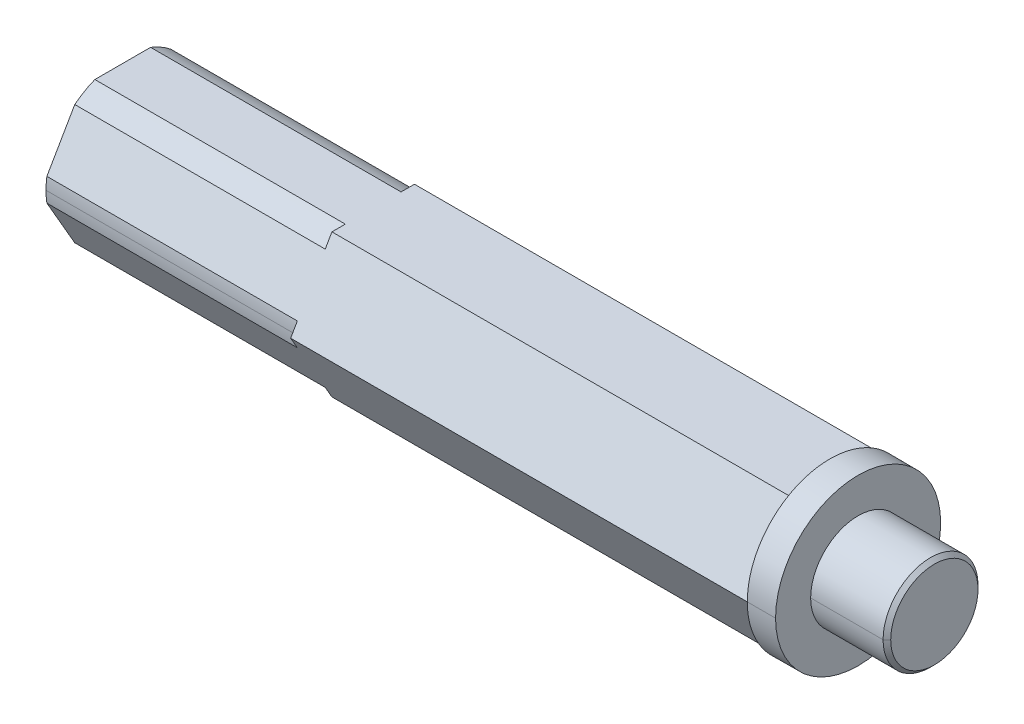
ISO-10303-21;
HEADER;
FILE_DESCRIPTION(('STEP AP214'),'2;1');
FILE_NAME('part.step','',(''),(''),'','','');
FILE_SCHEMA(('AUTOMOTIVE_DESIGN { 1 0 10303 214 1 1 1 1 }'));
ENDSEC;
DATA;
#1=APPLICATION_CONTEXT('core data for automotive mechanical design processes');
#2=APPLICATION_PROTOCOL_DEFINITION('international standard','automotive_design',2000,#1);
#3=PRODUCT_CONTEXT('',#1,'mechanical');
#4=PRODUCT('Part','Part','',(#3));
#5=PRODUCT_RELATED_PRODUCT_CATEGORY('part','',(#4));
#6=PRODUCT_DEFINITION_FORMATION('','',#4);
#7=PRODUCT_DEFINITION_CONTEXT('part definition',#1,'design');
#8=PRODUCT_DEFINITION('design','',#6,#7);
#9=PRODUCT_DEFINITION_SHAPE('','',#8);
#10=(LENGTH_UNIT() NAMED_UNIT(*) SI_UNIT(.MILLI.,.METRE.));
#11=(NAMED_UNIT(*) PLANE_ANGLE_UNIT() SI_UNIT($,.RADIAN.));
#12=(NAMED_UNIT(*) SI_UNIT($,.STERADIAN.) SOLID_ANGLE_UNIT());
#13=UNCERTAINTY_MEASURE_WITH_UNIT(LENGTH_MEASURE(1.E-05),#10,'distance_accuracy_value','');
#14=(GEOMETRIC_REPRESENTATION_CONTEXT(3) GLOBAL_UNCERTAINTY_ASSIGNED_CONTEXT((#13)) GLOBAL_UNIT_ASSIGNED_CONTEXT((#10,
#11,#12)) REPRESENTATION_CONTEXT('',''));
#15=CARTESIAN_POINT('',(0.,0.,0.));
#16=DIRECTION('',(0.,0.,1.));
#17=DIRECTION('',(1.,0.,0.));
#18=AXIS2_PLACEMENT_3D('',#15,#16,#17);
#19=CARTESIAN_POINT('',(30.5181,0.,0.));
#20=DIRECTION('',(-1.,0.,0.));
#21=DIRECTION('',(0.,0.,1.));
#22=AXIS2_PLACEMENT_3D('',#19,#20,#21);
#23=CONICAL_SURFACE('',#22,2.9083,0.785398163397448);
#24=DIRECTION('',(-0.707106781186548,0.,-0.707106781186547));
#25=VECTOR('',#24,1.);
#26=CARTESIAN_POINT('',(30.5181,0.,-2.9083));
#27=LINE('',#26,#25);
#28=CARTESIAN_POINT('',(30.5181,0.,-2.9083));
#29=VERTEX_POINT('',#28);
#30=CARTESIAN_POINT('',(30.2641,0.,-3.1623));
#31=VERTEX_POINT('',#30);
#32=EDGE_CURVE('E353',#29,#31,#27,.T.);
#33=ORIENTED_EDGE('',*,*,#32,.F.);
#34=CARTESIAN_POINT('',(30.5181,0.,0.));
#35=DIRECTION('',(1.,0.,0.));
#36=DIRECTION('',(0.,0.,-1.));
#37=AXIS2_PLACEMENT_3D('',#34,#35,#36);
#38=CIRCLE('',#37,2.9083);
#39=CARTESIAN_POINT('',(30.5181,0.,2.9083));
#40=VERTEX_POINT('',#39);
#41=EDGE_CURVE('E11',#40,#29,#38,.T.);
#42=ORIENTED_EDGE('',*,*,#41,.F.);
#43=DIRECTION('',(-0.707106781186548,0.,0.707106781186547));
#44=VECTOR('',#43,1.);
#45=CARTESIAN_POINT('',(30.5181,0.,2.9083));
#46=LINE('',#45,#44);
#47=CARTESIAN_POINT('',(30.2641,0.,3.1623));
#48=VERTEX_POINT('',#47);
#49=EDGE_CURVE('E299',#40,#48,#46,.T.);
#50=ORIENTED_EDGE('',*,*,#49,.T.);
#51=CARTESIAN_POINT('',(30.2641,0.,0.));
#52=DIRECTION('',(-1.,0.,0.));
#53=DIRECTION('',(0.,0.,-1.));
#54=AXIS2_PLACEMENT_3D('',#51,#52,#53);
#55=CIRCLE('',#54,3.1623);
#56=EDGE_CURVE('E27',#31,#48,#55,.T.);
#57=ORIENTED_EDGE('',*,*,#56,.F.);
#58=EDGE_LOOP('',(#33,#42,#50,#57));
#59=FACE_BOUND('',#58,.T.);
#60=ADVANCED_FACE('F16',(#59),#23,.T.);
#61=CARTESIAN_POINT('',(30.5181,0.,0.));
#62=DIRECTION('',(1.,0.,0.));
#63=DIRECTION('',(0.,1.,0.));
#64=AXIS2_PLACEMENT_3D('',#61,#62,#63);
#65=PLANE('',#64);
#66=ORIENTED_EDGE('',*,*,#41,.T.);
#67=CARTESIAN_POINT('',(30.5181,0.,0.));
#68=DIRECTION('',(1.,0.,0.));
#69=DIRECTION('',(0.,0.,-1.));
#70=AXIS2_PLACEMENT_3D('',#67,#68,#69);
#71=CIRCLE('',#70,2.9083);
#72=EDGE_CURVE('E207',#29,#40,#71,.T.);
#73=ORIENTED_EDGE('',*,*,#72,.T.);
#74=EDGE_LOOP('',(#66,#73));
#75=FACE_BOUND('',#74,.T.);
#76=ADVANCED_FACE('F623',(#75),#65,.T.);
#77=CARTESIAN_POINT('',(30.5181,0.,0.));
#78=DIRECTION('',(-1.,0.,0.));
#79=DIRECTION('',(0.,0.,1.));
#80=AXIS2_PLACEMENT_3D('',#77,#78,#79);
#81=CYLINDRICAL_SURFACE('',#80,3.1623);
#82=DIRECTION('',(-1.,0.,0.));
#83=VECTOR('',#82,1.);
#84=CARTESIAN_POINT('',(30.5181,0.,-3.1623));
#85=LINE('',#84,#83);
#86=CARTESIAN_POINT('',(25.4381,0.,-3.1623));
#87=VERTEX_POINT('',#86);
#88=EDGE_CURVE('E294',#31,#87,#85,.T.);
#89=ORIENTED_EDGE('',*,*,#88,.F.);
#90=ORIENTED_EDGE('',*,*,#56,.T.);
#91=DIRECTION('',(-1.,0.,0.));
#92=VECTOR('',#91,1.);
#93=CARTESIAN_POINT('',(30.5181,0.,3.1623));
#94=LINE('',#93,#92);
#95=CARTESIAN_POINT('',(25.4381,0.,3.1623));
#96=VERTEX_POINT('',#95);
#97=EDGE_CURVE('E20',#48,#96,#94,.T.);
#98=ORIENTED_EDGE('',*,*,#97,.T.);
#99=CARTESIAN_POINT('',(25.4381,0.,0.));
#100=DIRECTION('',(1.,0.,0.));
#101=DIRECTION('',(0.,0.,-1.));
#102=AXIS2_PLACEMENT_3D('',#99,#100,#101);
#103=CIRCLE('',#102,3.1623);
#104=EDGE_CURVE('E272',#96,#87,#103,.T.);
#105=ORIENTED_EDGE('',*,*,#104,.T.);
#106=EDGE_LOOP('',(#89,#90,#98,#105));
#107=FACE_BOUND('',#106,.T.);
#108=ADVANCED_FACE('F629',(#107),#81,.T.);
#109=CARTESIAN_POINT('',(25.4381,0.,0.));
#110=DIRECTION('',(1.,0.,0.));
#111=DIRECTION('',(0.,1.,0.));
#112=AXIS2_PLACEMENT_3D('',#109,#110,#111);
#113=PLANE('',#112);
#114=ORIENTED_EDGE('',*,*,#104,.F.);
#115=CARTESIAN_POINT('',(25.4381,0.,0.));
#116=DIRECTION('',(1.,0.,0.));
#117=DIRECTION('',(0.,0.,-1.));
#118=AXIS2_PLACEMENT_3D('',#115,#116,#117);
#119=CIRCLE('',#118,3.1623);
#120=EDGE_CURVE('E298',#87,#96,#119,.T.);
#121=ORIENTED_EDGE('',*,*,#120,.F.);
#122=EDGE_LOOP('',(#114,#121));
#123=FACE_BOUND('',#122,.T.);
#124=CARTESIAN_POINT('',(25.4381,0.,0.));
#125=DIRECTION('',(1.,0.,0.));
#126=DIRECTION('',(0.,0.,-1.));
#127=AXIS2_PLACEMENT_3D('',#124,#125,#126);
#128=CIRCLE('',#127,5.5);
#129=CARTESIAN_POINT('',(25.4381,0.,5.5));
#130=VERTEX_POINT('',#129);
#131=CARTESIAN_POINT('',(25.4381,0.,-5.5));
#132=VERTEX_POINT('',#131);
#133=EDGE_CURVE('E268',#130,#132,#128,.T.);
#134=ORIENTED_EDGE('',*,*,#133,.T.);
#135=CARTESIAN_POINT('',(25.4381,0.,0.));
#136=DIRECTION('',(1.,0.,0.));
#137=DIRECTION('',(0.,0.,-1.));
#138=AXIS2_PLACEMENT_3D('',#135,#136,#137);
#139=CIRCLE('',#138,5.5);
#140=EDGE_CURVE('E278',#132,#130,#139,.T.);
#141=ORIENTED_EDGE('',*,*,#140,.T.);
#142=EDGE_LOOP('',(#134,#141));
#143=FACE_BOUND('',#142,.T.);
#144=ADVANCED_FACE('F514',(#123,#143),#113,.T.);
#145=CARTESIAN_POINT('',(25.4381,0.,0.));
#146=DIRECTION('',(-1.,0.,0.));
#147=DIRECTION('',(0.,0.,1.));
#148=AXIS2_PLACEMENT_3D('',#145,#146,#147);
#149=CYLINDRICAL_SURFACE('',#148,5.5);
#150=DIRECTION('',(-1.,0.,0.));
#151=VECTOR('',#150,1.);
#152=CARTESIAN_POINT('',(25.4381,0.,-5.5));
#153=LINE('',#152,#151);
#154=CARTESIAN_POINT('',(23.5585,0.,-5.5));
#155=VERTEX_POINT('',#154);
#156=EDGE_CURVE('E282',#132,#155,#153,.T.);
#157=ORIENTED_EDGE('',*,*,#156,.F.);
#158=ORIENTED_EDGE('',*,*,#133,.F.);
#159=DIRECTION('',(-1.,0.,0.));
#160=VECTOR('',#159,1.);
#161=CARTESIAN_POINT('',(25.4381,0.,5.5));
#162=LINE('',#161,#160);
#163=CARTESIAN_POINT('',(23.5585,0.,5.5));
#164=VERTEX_POINT('',#163);
#165=EDGE_CURVE('E288',#130,#164,#162,.T.);
#166=ORIENTED_EDGE('',*,*,#165,.T.);
#167=CARTESIAN_POINT('',(23.5585,0.,0.));
#168=DIRECTION('',(1.,0.,0.));
#169=DIRECTION('',(0.,0.,-1.));
#170=AXIS2_PLACEMENT_3D('',#167,#168,#169);
#171=CIRCLE('',#170,5.5);
#172=EDGE_CURVE('E273',#164,#155,#171,.T.);
#173=ORIENTED_EDGE('',*,*,#172,.T.);
#174=EDGE_LOOP('',(#157,#158,#166,#173));
#175=FACE_BOUND('',#174,.T.);
#176=ADVANCED_FACE('F512',(#175),#149,.T.);
#177=CARTESIAN_POINT('',(23.5585,0.,0.));
#178=DIRECTION('',(1.,0.,0.));
#179=DIRECTION('',(0.,1.,0.));
#180=AXIS2_PLACEMENT_3D('',#177,#178,#179);
#181=PLANE('',#180);
#182=DIRECTION('',(0.,0.866025403784439,-0.5));
#183=VECTOR('',#182,1.);
#184=CARTESIAN_POINT('',(23.5585,-2.38125,-4.12444598552339));
#185=LINE('',#184,#183);
#186=CARTESIAN_POINT('',(23.5585,-4.7625,-2.7496306570156));
#187=VERTEX_POINT('',#186);
#188=CARTESIAN_POINT('',(23.5585,0.,-5.49926131403119));
#189=VERTEX_POINT('',#188);
#190=EDGE_CURVE('E320',#187,#189,#185,.T.);
#191=ORIENTED_EDGE('',*,*,#190,.T.);
#192=DIRECTION('',(0.,0.866025403784439,0.5));
#193=VECTOR('',#192,1.);
#194=CARTESIAN_POINT('',(23.5585,2.38125,-4.12444598552339));
#195=LINE('',#194,#193);
#196=CARTESIAN_POINT('',(23.5585,4.7625,-2.74963065701559));
#197=VERTEX_POINT('',#196);
#198=EDGE_CURVE('E218',#189,#197,#195,.T.);
#199=ORIENTED_EDGE('',*,*,#198,.T.);
#200=DIRECTION('',(0.,0.,1.));
#201=VECTOR('',#200,1.);
#202=CARTESIAN_POINT('',(23.5585,4.7625,0.));
#203=LINE('',#202,#201);
#204=CARTESIAN_POINT('',(23.5585,4.7625,2.7496306570156));
#205=VERTEX_POINT('',#204);
#206=EDGE_CURVE('E286',#197,#205,#203,.T.);
#207=ORIENTED_EDGE('',*,*,#206,.T.);
#208=DIRECTION('',(0.,-0.866025403784439,0.5));
#209=VECTOR('',#208,1.);
#210=CARTESIAN_POINT('',(23.5585,2.38125,4.12444598552339));
#211=LINE('',#210,#209);
#212=CARTESIAN_POINT('',(23.5585,0.,5.49926131403119));
#213=VERTEX_POINT('',#212);
#214=EDGE_CURVE('E261',#205,#213,#211,.T.);
#215=ORIENTED_EDGE('',*,*,#214,.T.);
#216=DIRECTION('',(0.,-0.866025403784439,-0.5));
#217=VECTOR('',#216,1.);
#218=CARTESIAN_POINT('',(23.5585,-2.38125,4.12444598552339));
#219=LINE('',#218,#217);
#220=CARTESIAN_POINT('',(23.5585,-4.7625,2.7496306570156));
#221=VERTEX_POINT('',#220);
#222=EDGE_CURVE('E306',#213,#221,#219,.T.);
#223=ORIENTED_EDGE('',*,*,#222,.T.);
#224=DIRECTION('',(0.,0.,-1.));
#225=VECTOR('',#224,1.);
#226=CARTESIAN_POINT('',(23.5585,-4.7625,0.));
#227=LINE('',#226,#225);
#228=EDGE_CURVE('E405',#221,#187,#227,.T.);
#229=ORIENTED_EDGE('',*,*,#228,.T.);
#230=EDGE_LOOP('',(#191,#199,#207,#215,#223,#229));
#231=FACE_BOUND('',#230,.T.);
#232=ORIENTED_EDGE('',*,*,#172,.F.);
#233=CARTESIAN_POINT('',(23.5585,0.,0.));
#234=DIRECTION('',(1.,0.,0.));
#235=DIRECTION('',(0.,0.,-1.));
#236=AXIS2_PLACEMENT_3D('',#233,#234,#235);
#237=CIRCLE('',#236,5.5);
#238=EDGE_CURVE('E293',#155,#164,#237,.T.);
#239=ORIENTED_EDGE('',*,*,#238,.F.);
#240=EDGE_LOOP('',(#232,#239));
#241=FACE_BOUND('',#240,.T.);
#242=ADVANCED_FACE('F508',(#231,#241),#181,.F.);
#243=CARTESIAN_POINT('',(-23.5585,0.,0.));
#244=DIRECTION('',(-1.,0.,0.));
#245=DIRECTION('',(0.,0.,1.));
#246=AXIS2_PLACEMENT_3D('',#243,#244,#245);
#247=CYLINDRICAL_SURFACE('',#246,1.7272);
#248=DIRECTION('',(-1.,0.,0.));
#249=VECTOR('',#248,1.);
#250=CARTESIAN_POINT('',(-23.5585,0.,-1.7272));
#251=LINE('',#250,#249);
#252=CARTESIAN_POINT('',(-7.6835,0.,-1.7272));
#253=VERTEX_POINT('',#252);
#254=CARTESIAN_POINT('',(-23.5585,0.,-1.7272));
#255=VERTEX_POINT('',#254);
#256=EDGE_CURVE('E214',#253,#255,#251,.T.);
#257=ORIENTED_EDGE('',*,*,#256,.F.);
#258=CARTESIAN_POINT('',(-7.6835,0.,0.));
#259=DIRECTION('',(-1.,0.,0.));
#260=DIRECTION('',(0.,0.,1.));
#261=AXIS2_PLACEMENT_3D('',#258,#259,#260);
#262=CIRCLE('',#261,1.7272);
#263=CARTESIAN_POINT('',(-7.6835,0.,1.7272));
#264=VERTEX_POINT('',#263);
#265=EDGE_CURVE('E436',#264,#253,#262,.T.);
#266=ORIENTED_EDGE('',*,*,#265,.F.);
#267=DIRECTION('',(-1.,0.,0.));
#268=VECTOR('',#267,1.);
#269=CARTESIAN_POINT('',(-23.5585,0.,1.7272));
#270=LINE('',#269,#268);
#271=CARTESIAN_POINT('',(-23.5585,0.,1.7272));
#272=VERTEX_POINT('',#271);
#273=EDGE_CURVE('E213',#264,#272,#270,.T.);
#274=ORIENTED_EDGE('',*,*,#273,.T.);
#275=CARTESIAN_POINT('',(-23.5585,0.,0.));
#276=DIRECTION('',(-1.,0.,0.));
#277=DIRECTION('',(0.,0.,1.));
#278=AXIS2_PLACEMENT_3D('',#275,#276,#277);
#279=CIRCLE('',#278,1.7272);
#280=EDGE_CURVE('E178',#272,#255,#279,.T.);
#281=ORIENTED_EDGE('',*,*,#280,.T.);
#282=EDGE_LOOP('',(#257,#266,#274,#281));
#283=FACE_BOUND('',#282,.T.);
#284=ADVANCED_FACE('F656',(#283),#247,.F.);
#285=CARTESIAN_POINT('',(-7.6835,0.,0.));
#286=DIRECTION('',(-1.,0.,0.));
#287=DIRECTION('',(0.,0.,1.));
#288=AXIS2_PLACEMENT_3D('',#285,#286,#287);
#289=CONICAL_SURFACE('',#288,1.7272,1.02974425867665);
#290=DIRECTION('',(-0.515038074910057,0.,-0.857167300702111));
#291=VECTOR('',#290,1.);
#292=CARTESIAN_POINT('',(-7.6835,0.,-1.7272));
#293=LINE('',#292,#291);
#294=CARTESIAN_POINT('',(-6.64569353881559,0.,0.));
#295=VERTEX_POINT('',#294);
#296=EDGE_CURVE('E423',#295,#253,#293,.T.);
#297=ORIENTED_EDGE('',*,*,#296,.F.);
#298=DIRECTION('',(-0.515038074910057,0.,0.857167300702111));
#299=VECTOR('',#298,1.);
#300=CARTESIAN_POINT('',(-7.6835,0.,1.7272));
#301=LINE('',#300,#299);
#302=EDGE_CURVE('E222',#295,#264,#301,.T.);
#303=ORIENTED_EDGE('',*,*,#302,.T.);
#304=ORIENTED_EDGE('',*,*,#265,.T.);
#305=EDGE_LOOP('',(#297,#303,#304));
#306=FACE_BOUND('',#305,.T.);
#307=ADVANCED_FACE('F18',(#306),#289,.F.);
#308=CARTESIAN_POINT('',(-6.8707,0.,0.));
#309=DIRECTION('',(1.,0.,0.));
#310=DIRECTION('',(0.,1.,0.));
#311=AXIS2_PLACEMENT_3D('',#308,#309,#310);
#312=PLANE('',#311);
#313=DIRECTION('',(0.,0.866025403784439,0.5));
#314=VECTOR('',#313,1.);
#315=CARTESIAN_POINT('',(-6.8707,0.,-5.49926131403119));
#316=LINE('',#315,#314);
#317=CARTESIAN_POINT('',(-6.8707,3.98949014356532,-3.19592810571439));
#318=VERTEX_POINT('',#317);
#319=CARTESIAN_POINT('',(-6.8707,4.7625,-2.74963065701559));
#320=VERTEX_POINT('',#319);
#321=EDGE_CURVE('E300',#318,#320,#316,.T.);
#322=ORIENTED_EDGE('',*,*,#321,.F.);
#323=CARTESIAN_POINT('',(-6.8707,0.,0.));
#324=DIRECTION('',(1.,0.,0.));
#325=DIRECTION('',(0.,0.,-1.));
#326=AXIS2_PLACEMENT_3D('',#323,#324,#325);
#327=CIRCLE('',#326,5.11175);
#328=CARTESIAN_POINT('',(-6.8707,4.7625,-1.85703575961799));
#329=VERTEX_POINT('',#328);
#330=EDGE_CURVE('E227',#318,#329,#327,.T.);
#331=ORIENTED_EDGE('',*,*,#330,.T.);
#332=DIRECTION('',(0.,0.,1.));
#333=VECTOR('',#332,1.);
#334=CARTESIAN_POINT('',(-6.8707,4.7625,-2.74963065701559));
#335=LINE('',#334,#333);
#336=EDGE_CURVE('E283',#320,#329,#335,.T.);
#337=ORIENTED_EDGE('',*,*,#336,.F.);
#338=EDGE_LOOP('',(#322,#331,#337));
#339=FACE_BOUND('',#338,.T.);
#340=ADVANCED_FACE('F659',(#339),#312,.F.);
#341=CARTESIAN_POINT('',(-6.8707,0.,0.));
#342=DIRECTION('',(1.,0.,0.));
#343=DIRECTION('',(0.,1.,0.));
#344=AXIS2_PLACEMENT_3D('',#341,#342,#343);
#345=PLANE('',#344);
#346=DIRECTION('',(0.,0.,1.));
#347=VECTOR('',#346,1.);
#348=CARTESIAN_POINT('',(-6.8707,4.7625,-2.74963065701559));
#349=LINE('',#348,#347);
#350=CARTESIAN_POINT('',(-6.8707,4.7625,1.85703575961799));
#351=VERTEX_POINT('',#350);
#352=CARTESIAN_POINT('',(-6.8707,4.7625,2.7496306570156));
#353=VERTEX_POINT('',#352);
#354=EDGE_CURVE('E274',#351,#353,#349,.T.);
#355=ORIENTED_EDGE('',*,*,#354,.F.);
#356=CARTESIAN_POINT('',(-6.8707,0.,0.));
#357=DIRECTION('',(1.,0.,0.));
#358=DIRECTION('',(0.,0.,-1.));
#359=AXIS2_PLACEMENT_3D('',#356,#357,#358);
#360=CIRCLE('',#359,5.11175);
#361=CARTESIAN_POINT('',(-6.8707,3.98949014356532,3.19592810571439));
#362=VERTEX_POINT('',#361);
#363=EDGE_CURVE('E358',#351,#362,#360,.T.);
#364=ORIENTED_EDGE('',*,*,#363,.T.);
#365=DIRECTION('',(0.,-0.866025403784439,0.5));
#366=VECTOR('',#365,1.);
#367=CARTESIAN_POINT('',(-6.8707,4.7625,2.7496306570156));
#368=LINE('',#367,#366);
#369=EDGE_CURVE('E231',#353,#362,#368,.T.);
#370=ORIENTED_EDGE('',*,*,#369,.F.);
#371=EDGE_LOOP('',(#355,#364,#370));
#372=FACE_BOUND('',#371,.T.);
#373=ADVANCED_FACE('F662',(#372),#345,.F.);
#374=CARTESIAN_POINT('',(-6.8707,0.,0.));
#375=DIRECTION('',(1.,0.,0.));
#376=DIRECTION('',(0.,1.,0.));
#377=AXIS2_PLACEMENT_3D('',#374,#375,#376);
#378=PLANE('',#377);
#379=DIRECTION('',(0.,-0.866025403784439,0.5));
#380=VECTOR('',#379,1.);
#381=CARTESIAN_POINT('',(-6.8707,4.7625,2.7496306570156));
#382=LINE('',#381,#380);
#383=CARTESIAN_POINT('',(-6.8707,0.773009856434686,5.05296386533239));
#384=VERTEX_POINT('',#383);
#385=CARTESIAN_POINT('',(-6.8707,0.,5.49926131403119));
#386=VERTEX_POINT('',#385);
#387=EDGE_CURVE('E230',#384,#386,#382,.T.);
#388=ORIENTED_EDGE('',*,*,#387,.F.);
#389=CARTESIAN_POINT('',(-6.8707,0.,0.));
#390=DIRECTION('',(1.,0.,0.));
#391=DIRECTION('',(0.,0.,-1.));
#392=AXIS2_PLACEMENT_3D('',#389,#390,#391);
#393=CIRCLE('',#392,5.11175);
#394=CARTESIAN_POINT('',(-6.8707,0.,5.11175));
#395=VERTEX_POINT('',#394);
#396=EDGE_CURVE('E247',#384,#395,#393,.T.);
#397=ORIENTED_EDGE('',*,*,#396,.T.);
#398=CARTESIAN_POINT('',(-6.8707,0.,0.));
#399=DIRECTION('',(1.,0.,0.));
#400=DIRECTION('',(0.,0.,-1.));
#401=AXIS2_PLACEMENT_3D('',#398,#399,#400);
#402=CIRCLE('',#401,5.11175);
#403=CARTESIAN_POINT('',(-6.8707,-0.773009856434689,5.05296386533239));
#404=VERTEX_POINT('',#403);
#405=EDGE_CURVE('E419',#395,#404,#402,.T.);
#406=ORIENTED_EDGE('',*,*,#405,.T.);
#407=DIRECTION('',(0.,-0.866025403784439,-0.5));
#408=VECTOR('',#407,1.);
#409=CARTESIAN_POINT('',(-6.8707,0.,5.49926131403119));
#410=LINE('',#409,#408);
#411=EDGE_CURVE('E310',#386,#404,#410,.T.);
#412=ORIENTED_EDGE('',*,*,#411,.F.);
#413=EDGE_LOOP('',(#388,#397,#406,#412));
#414=FACE_BOUND('',#413,.T.);
#415=ADVANCED_FACE('F605',(#414),#378,.F.);
#416=CARTESIAN_POINT('',(-6.8707,0.,0.));
#417=DIRECTION('',(1.,0.,0.));
#418=DIRECTION('',(0.,1.,0.));
#419=AXIS2_PLACEMENT_3D('',#416,#417,#418);
#420=PLANE('',#419);
#421=DIRECTION('',(0.,-0.866025403784439,-0.5));
#422=VECTOR('',#421,1.);
#423=CARTESIAN_POINT('',(-6.8707,0.,5.49926131403119));
#424=LINE('',#423,#422);
#425=CARTESIAN_POINT('',(-6.8707,-3.98949014356532,3.19592810571439));
#426=VERTEX_POINT('',#425);
#427=CARTESIAN_POINT('',(-6.8707,-4.7625,2.7496306570156));
#428=VERTEX_POINT('',#427);
#429=EDGE_CURVE('E429',#426,#428,#424,.T.);
#430=ORIENTED_EDGE('',*,*,#429,.F.);
#431=CARTESIAN_POINT('',(-6.8707,0.,0.));
#432=DIRECTION('',(1.,0.,0.));
#433=DIRECTION('',(0.,0.,-1.));
#434=AXIS2_PLACEMENT_3D('',#431,#432,#433);
#435=CIRCLE('',#434,5.11175);
#436=CARTESIAN_POINT('',(-6.8707,-4.7625,1.85703575961799));
#437=VERTEX_POINT('',#436);
#438=EDGE_CURVE('E234',#426,#437,#435,.T.);
#439=ORIENTED_EDGE('',*,*,#438,.T.);
#440=DIRECTION('',(0.,0.,-1.));
#441=VECTOR('',#440,1.);
#442=CARTESIAN_POINT('',(-6.8707,-4.7625,2.7496306570156));
#443=LINE('',#442,#441);
#444=EDGE_CURVE('E386',#428,#437,#443,.T.);
#445=ORIENTED_EDGE('',*,*,#444,.F.);
#446=EDGE_LOOP('',(#430,#439,#445));
#447=FACE_BOUND('',#446,.T.);
#448=ADVANCED_FACE('F462',(#447),#420,.F.);
#449=CARTESIAN_POINT('',(-6.8707,0.,0.));
#450=DIRECTION('',(1.,0.,0.));
#451=DIRECTION('',(0.,1.,0.));
#452=AXIS2_PLACEMENT_3D('',#449,#450,#451);
#453=PLANE('',#452);
#454=DIRECTION('',(0.,0.,-1.));
#455=VECTOR('',#454,1.);
#456=CARTESIAN_POINT('',(-6.8707,-4.7625,2.7496306570156));
#457=LINE('',#456,#455);
#458=CARTESIAN_POINT('',(-6.8707,-4.7625,-1.85703575961799));
#459=VERTEX_POINT('',#458);
#460=CARTESIAN_POINT('',(-6.8707,-4.7625,-2.7496306570156));
#461=VERTEX_POINT('',#460);
#462=EDGE_CURVE('E367',#459,#461,#457,.T.);
#463=ORIENTED_EDGE('',*,*,#462,.F.);
#464=CARTESIAN_POINT('',(-6.8707,0.,0.));
#465=DIRECTION('',(1.,0.,0.));
#466=DIRECTION('',(0.,0.,-1.));
#467=AXIS2_PLACEMENT_3D('',#464,#465,#466);
#468=CIRCLE('',#467,5.11175);
#469=CARTESIAN_POINT('',(-6.8707,-3.98949014356532,-3.19592810571439));
#470=VERTEX_POINT('',#469);
#471=EDGE_CURVE('E312',#459,#470,#468,.T.);
#472=ORIENTED_EDGE('',*,*,#471,.T.);
#473=DIRECTION('',(0.,0.866025403784439,-0.5));
#474=VECTOR('',#473,1.);
#475=CARTESIAN_POINT('',(-6.8707,-4.7625,-2.7496306570156));
#476=LINE('',#475,#474);
#477=EDGE_CURVE('E42',#461,#470,#476,.T.);
#478=ORIENTED_EDGE('',*,*,#477,.F.);
#479=EDGE_LOOP('',(#463,#472,#478));
#480=FACE_BOUND('',#479,.T.);
#481=ADVANCED_FACE('F647',(#480),#453,.F.);
#482=CARTESIAN_POINT('',(-6.8707,0.,0.));
#483=DIRECTION('',(1.,0.,0.));
#484=DIRECTION('',(0.,1.,0.));
#485=AXIS2_PLACEMENT_3D('',#482,#483,#484);
#486=PLANE('',#485);
#487=DIRECTION('',(0.,0.866025403784439,-0.5));
#488=VECTOR('',#487,1.);
#489=CARTESIAN_POINT('',(-6.8707,-4.7625,-2.7496306570156));
#490=LINE('',#489,#488);
#491=CARTESIAN_POINT('',(-6.8707,-0.773009856434678,-5.05296386533239));
#492=VERTEX_POINT('',#491);
#493=CARTESIAN_POINT('',(-6.8707,0.,-5.49926131403119));
#494=VERTEX_POINT('',#493);
#495=EDGE_CURVE('E168',#492,#494,#490,.T.);
#496=ORIENTED_EDGE('',*,*,#495,.F.);
#497=CARTESIAN_POINT('',(-6.8707,0.,0.));
#498=DIRECTION('',(1.,0.,0.));
#499=DIRECTION('',(0.,0.,-1.));
#500=AXIS2_PLACEMENT_3D('',#497,#498,#499);
#501=CIRCLE('',#500,5.11175);
#502=CARTESIAN_POINT('',(-6.8707,0.773009856434683,-5.05296386533239));
#503=VERTEX_POINT('',#502);
#504=EDGE_CURVE('E172',#492,#503,#501,.T.);
#505=ORIENTED_EDGE('',*,*,#504,.T.);
#506=DIRECTION('',(0.,0.866025403784439,0.5));
#507=VECTOR('',#506,1.);
#508=CARTESIAN_POINT('',(-6.8707,0.,-5.49926131403119));
#509=LINE('',#508,#507);
#510=EDGE_CURVE('E173',#494,#503,#509,.T.);
#511=ORIENTED_EDGE('',*,*,#510,.F.);
#512=EDGE_LOOP('',(#496,#505,#511));
#513=FACE_BOUND('',#512,.T.);
#514=ADVANCED_FACE('F170',(#513),#486,.F.);
#515=CARTESIAN_POINT('',(-23.5585,0.,0.));
#516=DIRECTION('',(1.,0.,0.));
#517=DIRECTION('',(0.,1.,0.));
#518=AXIS2_PLACEMENT_3D('',#515,#516,#517);
#519=PLANE('',#518);
#520=ORIENTED_EDGE('',*,*,#280,.F.);
#521=CARTESIAN_POINT('',(-23.5585,0.,0.));
#522=DIRECTION('',(-1.,0.,0.));
#523=DIRECTION('',(0.,0.,1.));
#524=AXIS2_PLACEMENT_3D('',#521,#522,#523);
#525=CIRCLE('',#524,1.7272);
#526=EDGE_CURVE('E209',#255,#272,#525,.T.);
#527=ORIENTED_EDGE('',*,*,#526,.F.);
#528=EDGE_LOOP('',(#520,#527));
#529=FACE_BOUND('',#528,.T.);
#530=DIRECTION('',(0.,0.866025403784439,0.5));
#531=VECTOR('',#530,1.);
#532=CARTESIAN_POINT('',(-23.5585,2.38125,-4.12444598552339));
#533=LINE('',#532,#531);
#534=CARTESIAN_POINT('',(-23.5585,0.773009856434685,-5.05296386533239));
#535=VERTEX_POINT('',#534);
#536=CARTESIAN_POINT('',(-23.5585,3.98949014356532,-3.19592810571439));
#537=VERTEX_POINT('',#536);
#538=EDGE_CURVE('E305',#535,#537,#533,.T.);
#539=ORIENTED_EDGE('',*,*,#538,.F.);
#540=CARTESIAN_POINT('',(-23.5585,0.,0.));
#541=DIRECTION('',(1.,0.,0.));
#542=DIRECTION('',(0.,0.,-1.));
#543=AXIS2_PLACEMENT_3D('',#540,#541,#542);
#544=CIRCLE('',#543,5.11175);
#545=CARTESIAN_POINT('',(-23.5585,-0.773009856434681,-5.05296386533239));
#546=VERTEX_POINT('',#545);
#547=EDGE_CURVE('E190',#546,#535,#544,.T.);
#548=ORIENTED_EDGE('',*,*,#547,.F.);
#549=DIRECTION('',(0.,0.866025403784439,-0.5));
#550=VECTOR('',#549,1.);
#551=CARTESIAN_POINT('',(-23.5585,-2.38125,-4.12444598552339));
#552=LINE('',#551,#550);
#553=CARTESIAN_POINT('',(-23.5585,-3.98949014356532,-3.19592810571439));
#554=VERTEX_POINT('',#553);
#555=EDGE_CURVE('E179',#554,#546,#552,.T.);
#556=ORIENTED_EDGE('',*,*,#555,.F.);
#557=CARTESIAN_POINT('',(-23.5585,0.,0.));
#558=DIRECTION('',(1.,0.,0.));
#559=DIRECTION('',(0.,0.,-1.));
#560=AXIS2_PLACEMENT_3D('',#557,#558,#559);
#561=CIRCLE('',#560,5.11175);
#562=CARTESIAN_POINT('',(-23.5585,-4.7625,-1.85703575961799));
#563=VERTEX_POINT('',#562);
#564=EDGE_CURVE('E203',#563,#554,#561,.T.);
#565=ORIENTED_EDGE('',*,*,#564,.F.);
#566=DIRECTION('',(0.,0.,-1.));
#567=VECTOR('',#566,1.);
#568=CARTESIAN_POINT('',(-23.5585,-4.7625,0.));
#569=LINE('',#568,#567);
#570=CARTESIAN_POINT('',(-23.5585,-4.7625,1.85703575961799));
#571=VERTEX_POINT('',#570);
#572=EDGE_CURVE('E371',#571,#563,#569,.T.);
#573=ORIENTED_EDGE('',*,*,#572,.F.);
#574=CARTESIAN_POINT('',(-23.5585,0.,0.));
#575=DIRECTION('',(1.,0.,0.));
#576=DIRECTION('',(0.,0.,-1.));
#577=AXIS2_PLACEMENT_3D('',#574,#575,#576);
#578=CIRCLE('',#577,5.11175);
#579=CARTESIAN_POINT('',(-23.5585,-3.98949014356532,3.19592810571439));
#580=VERTEX_POINT('',#579);
#581=EDGE_CURVE('E366',#580,#571,#578,.T.);
#582=ORIENTED_EDGE('',*,*,#581,.F.);
#583=DIRECTION('',(0.,-0.866025403784439,-0.5));
#584=VECTOR('',#583,1.);
#585=CARTESIAN_POINT('',(-23.5585,-2.38125,4.12444598552339));
#586=LINE('',#585,#584);
#587=CARTESIAN_POINT('',(-23.5585,-0.773009856434688,5.05296386533239));
#588=VERTEX_POINT('',#587);
#589=EDGE_CURVE('E468',#588,#580,#586,.T.);
#590=ORIENTED_EDGE('',*,*,#589,.F.);
#591=CARTESIAN_POINT('',(-23.5585,0.,0.));
#592=DIRECTION('',(1.,0.,0.));
#593=DIRECTION('',(0.,0.,-1.));
#594=AXIS2_PLACEMENT_3D('',#591,#592,#593);
#595=CIRCLE('',#594,5.11175);
#596=CARTESIAN_POINT('',(-23.5585,0.,5.11175));
#597=VERTEX_POINT('',#596);
#598=EDGE_CURVE('E228',#597,#588,#595,.T.);
#599=ORIENTED_EDGE('',*,*,#598,.F.);
#600=CARTESIAN_POINT('',(-23.5585,0.,0.));
#601=DIRECTION('',(1.,0.,0.));
#602=DIRECTION('',(0.,0.,-1.));
#603=AXIS2_PLACEMENT_3D('',#600,#601,#602);
#604=CIRCLE('',#603,5.11175);
#605=CARTESIAN_POINT('',(-23.5585,0.773009856434688,5.05296386533239));
#606=VERTEX_POINT('',#605);
#607=EDGE_CURVE('E232',#606,#597,#604,.T.);
#608=ORIENTED_EDGE('',*,*,#607,.F.);
#609=DIRECTION('',(0.,-0.866025403784439,0.5));
#610=VECTOR('',#609,1.);
#611=CARTESIAN_POINT('',(-23.5585,2.38125,4.12444598552339));
#612=LINE('',#611,#610);
#613=CARTESIAN_POINT('',(-23.5585,3.98949014356532,3.19592810571439));
#614=VERTEX_POINT('',#613);
#615=EDGE_CURVE('E128',#614,#606,#612,.T.);
#616=ORIENTED_EDGE('',*,*,#615,.F.);
#617=CARTESIAN_POINT('',(-23.5585,0.,0.));
#618=DIRECTION('',(1.,0.,0.));
#619=DIRECTION('',(0.,0.,-1.));
#620=AXIS2_PLACEMENT_3D('',#617,#618,#619);
#621=CIRCLE('',#620,5.11175);
#622=CARTESIAN_POINT('',(-23.5585,4.7625,1.85703575961799));
#623=VERTEX_POINT('',#622);
#624=EDGE_CURVE('E338',#623,#614,#621,.T.);
#625=ORIENTED_EDGE('',*,*,#624,.F.);
#626=DIRECTION('',(0.,0.,1.));
#627=VECTOR('',#626,1.);
#628=CARTESIAN_POINT('',(-23.5585,4.7625,0.));
#629=LINE('',#628,#627);
#630=CARTESIAN_POINT('',(-23.5585,4.7625,-1.85703575961799));
#631=VERTEX_POINT('',#630);
#632=EDGE_CURVE('E115',#631,#623,#629,.T.);
#633=ORIENTED_EDGE('',*,*,#632,.F.);
#634=CARTESIAN_POINT('',(-23.5585,0.,0.));
#635=DIRECTION('',(1.,0.,0.));
#636=DIRECTION('',(0.,0.,-1.));
#637=AXIS2_PLACEMENT_3D('',#634,#635,#636);
#638=CIRCLE('',#637,5.11175);
#639=EDGE_CURVE('E259',#537,#631,#638,.T.);
#640=ORIENTED_EDGE('',*,*,#639,.F.);
#641=EDGE_LOOP('',(#539,#548,#556,#565,#573,#582,#590,#599,#608,#616,#625,#633,#640));
#642=FACE_BOUND('',#641,.T.);
#643=ADVANCED_FACE('F641',(#529,#642),#519,.F.);
#644=CARTESIAN_POINT('',(23.5585,-2.38125,-4.12444598552339));
#645=DIRECTION('',(0.,0.5,0.866025403784439));
#646=DIRECTION('',(1.,0.,0.));
#647=AXIS2_PLACEMENT_3D('',#644,#645,#646);
#648=PLANE('',#647);
#649=ORIENTED_EDGE('',*,*,#190,.F.);
#650=DIRECTION('',(1.,0.,0.));
#651=VECTOR('',#650,1.);
#652=CARTESIAN_POINT('',(-6.8707,-4.7625,-2.7496306570156));
#653=LINE('',#652,#651);
#654=EDGE_CURVE('E324',#461,#187,#653,.T.);
#655=ORIENTED_EDGE('',*,*,#654,.F.);
#656=ORIENTED_EDGE('',*,*,#477,.T.);
#657=DIRECTION('',(-1.,0.,0.));
#658=VECTOR('',#657,1.);
#659=CARTESIAN_POINT('',(23.5585,-3.98949014356532,-3.19592810571439));
#660=LINE('',#659,#658);
#661=EDGE_CURVE('E197',#470,#554,#660,.T.);
#662=ORIENTED_EDGE('',*,*,#661,.T.);
#663=ORIENTED_EDGE('',*,*,#555,.T.);
#664=DIRECTION('',(-1.,0.,0.));
#665=VECTOR('',#664,1.);
#666=CARTESIAN_POINT('',(23.5585,-0.773009856434681,-5.05296386533239));
#667=LINE('',#666,#665);
#668=EDGE_CURVE('E183',#492,#546,#667,.T.);
#669=ORIENTED_EDGE('',*,*,#668,.F.);
#670=ORIENTED_EDGE('',*,*,#495,.T.);
#671=DIRECTION('',(1.,0.,0.));
#672=VECTOR('',#671,1.);
#673=CARTESIAN_POINT('',(-6.8707,0.,-5.49926131403119));
#674=LINE('',#673,#672);
#675=EDGE_CURVE('E215',#494,#189,#674,.T.);
#676=ORIENTED_EDGE('',*,*,#675,.T.);
#677=EDGE_LOOP('',(#649,#655,#656,#662,#663,#669,#670,#676));
#678=FACE_BOUND('',#677,.T.);
#679=ADVANCED_FACE('F184',(#678),#648,.F.);
#680=CARTESIAN_POINT('',(23.5585,-4.7625,0.));
#681=DIRECTION('',(0.,1.,0.));
#682=DIRECTION('',(0.,0.,-1.));
#683=AXIS2_PLACEMENT_3D('',#680,#681,#682);
#684=PLANE('',#683);
#685=ORIENTED_EDGE('',*,*,#228,.F.);
#686=DIRECTION('',(1.,0.,0.));
#687=VECTOR('',#686,1.);
#688=CARTESIAN_POINT('',(-6.8707,-4.7625,2.7496306570156));
#689=LINE('',#688,#687);
#690=EDGE_CURVE('E409',#428,#221,#689,.T.);
#691=ORIENTED_EDGE('',*,*,#690,.F.);
#692=ORIENTED_EDGE('',*,*,#444,.T.);
#693=DIRECTION('',(-1.,0.,0.));
#694=VECTOR('',#693,1.);
#695=CARTESIAN_POINT('',(23.5585,-4.7625,1.85703575961799));
#696=LINE('',#695,#694);
#697=EDGE_CURVE('E316',#437,#571,#696,.T.);
#698=ORIENTED_EDGE('',*,*,#697,.T.);
#699=ORIENTED_EDGE('',*,*,#572,.T.);
#700=DIRECTION('',(-1.,0.,0.));
#701=VECTOR('',#700,1.);
#702=CARTESIAN_POINT('',(23.5585,-4.7625,-1.85703575961799));
#703=LINE('',#702,#701);
#704=EDGE_CURVE('E315',#459,#563,#703,.T.);
#705=ORIENTED_EDGE('',*,*,#704,.F.);
#706=ORIENTED_EDGE('',*,*,#462,.T.);
#707=ORIENTED_EDGE('',*,*,#654,.T.);
#708=EDGE_LOOP('',(#685,#691,#692,#698,#699,#705,#706,#707));
#709=FACE_BOUND('',#708,.T.);
#710=ADVANCED_FACE('F450',(#709),#684,.F.);
#711=CARTESIAN_POINT('',(23.5585,-2.38125,4.12444598552339));
#712=DIRECTION('',(0.,0.5,-0.866025403784439));
#713=DIRECTION('',(-1.,0.,0.));
#714=AXIS2_PLACEMENT_3D('',#711,#712,#713);
#715=PLANE('',#714);
#716=ORIENTED_EDGE('',*,*,#222,.F.);
#717=DIRECTION('',(1.,0.,0.));
#718=VECTOR('',#717,1.);
#719=CARTESIAN_POINT('',(-6.8707,0.,5.49926131403119));
#720=LINE('',#719,#718);
#721=EDGE_CURVE('E311',#386,#213,#720,.T.);
#722=ORIENTED_EDGE('',*,*,#721,.F.);
#723=ORIENTED_EDGE('',*,*,#411,.T.);
#724=DIRECTION('',(-1.,0.,0.));
#725=VECTOR('',#724,1.);
#726=CARTESIAN_POINT('',(23.5585,-0.773009856434688,5.05296386533239));
#727=LINE('',#726,#725);
#728=EDGE_CURVE('E223',#404,#588,#727,.T.);
#729=ORIENTED_EDGE('',*,*,#728,.T.);
#730=ORIENTED_EDGE('',*,*,#589,.T.);
#731=DIRECTION('',(-1.,0.,0.));
#732=VECTOR('',#731,1.);
#733=CARTESIAN_POINT('',(23.5585,-3.98949014356532,3.19592810571439));
#734=LINE('',#733,#732);
#735=EDGE_CURVE('E245',#426,#580,#734,.T.);
#736=ORIENTED_EDGE('',*,*,#735,.F.);
#737=ORIENTED_EDGE('',*,*,#429,.T.);
#738=ORIENTED_EDGE('',*,*,#690,.T.);
#739=EDGE_LOOP('',(#716,#722,#723,#729,#730,#736,#737,#738));
#740=FACE_BOUND('',#739,.T.);
#741=ADVANCED_FACE('F472',(#740),#715,.F.);
#742=CARTESIAN_POINT('',(23.5585,2.38125,4.12444598552339));
#743=DIRECTION('',(0.,-0.5,-0.866025403784439));
#744=DIRECTION('',(0.,-0.866025403784439,0.5));
#745=AXIS2_PLACEMENT_3D('',#742,#743,#744);
#746=PLANE('',#745);
#747=ORIENTED_EDGE('',*,*,#214,.F.);
#748=DIRECTION('',(1.,0.,0.));
#749=VECTOR('',#748,1.);
#750=CARTESIAN_POINT('',(-6.8707,4.7625,2.7496306570156));
#751=LINE('',#750,#749);
#752=EDGE_CURVE('E265',#353,#205,#751,.T.);
#753=ORIENTED_EDGE('',*,*,#752,.F.);
#754=ORIENTED_EDGE('',*,*,#369,.T.);
#755=DIRECTION('',(-1.,0.,0.));
#756=VECTOR('',#755,1.);
#757=CARTESIAN_POINT('',(23.5585,3.98949014356532,3.19592810571439));
#758=LINE('',#757,#756);
#759=EDGE_CURVE('E255',#362,#614,#758,.T.);
#760=ORIENTED_EDGE('',*,*,#759,.T.);
#761=ORIENTED_EDGE('',*,*,#615,.T.);
#762=DIRECTION('',(-1.,0.,0.));
#763=VECTOR('',#762,1.);
#764=CARTESIAN_POINT('',(23.5585,0.773009856434688,5.05296386533239));
#765=LINE('',#764,#763);
#766=EDGE_CURVE('E235',#384,#606,#765,.T.);
#767=ORIENTED_EDGE('',*,*,#766,.F.);
#768=ORIENTED_EDGE('',*,*,#387,.T.);
#769=ORIENTED_EDGE('',*,*,#721,.T.);
#770=EDGE_LOOP('',(#747,#753,#754,#760,#761,#767,#768,#769));
#771=FACE_BOUND('',#770,.T.);
#772=ADVANCED_FACE('F597',(#771),#746,.F.);
#773=CARTESIAN_POINT('',(23.5585,4.7625,0.));
#774=DIRECTION('',(0.,-1.,0.));
#775=DIRECTION('',(0.,0.,-1.));
#776=AXIS2_PLACEMENT_3D('',#773,#774,#775);
#777=PLANE('',#776);
#778=ORIENTED_EDGE('',*,*,#206,.F.);
#779=DIRECTION('',(1.,0.,0.));
#780=VECTOR('',#779,1.);
#781=CARTESIAN_POINT('',(-6.8707,4.7625,-2.74963065701559));
#782=LINE('',#781,#780);
#783=EDGE_CURVE('E304',#320,#197,#782,.T.);
#784=ORIENTED_EDGE('',*,*,#783,.F.);
#785=ORIENTED_EDGE('',*,*,#336,.T.);
#786=DIRECTION('',(-1.,0.,0.));
#787=VECTOR('',#786,1.);
#788=CARTESIAN_POINT('',(23.5585,4.7625,-1.85703575961799));
#789=LINE('',#788,#787);
#790=EDGE_CURVE('E362',#329,#631,#789,.T.);
#791=ORIENTED_EDGE('',*,*,#790,.T.);
#792=ORIENTED_EDGE('',*,*,#632,.T.);
#793=DIRECTION('',(-1.,0.,0.));
#794=VECTOR('',#793,1.);
#795=CARTESIAN_POINT('',(23.5585,4.7625,1.85703575961799));
#796=LINE('',#795,#794);
#797=EDGE_CURVE('E342',#351,#623,#796,.T.);
#798=ORIENTED_EDGE('',*,*,#797,.F.);
#799=ORIENTED_EDGE('',*,*,#354,.T.);
#800=ORIENTED_EDGE('',*,*,#752,.T.);
#801=EDGE_LOOP('',(#778,#784,#785,#791,#792,#798,#799,#800));
#802=FACE_BOUND('',#801,.T.);
#803=ADVANCED_FACE('F593',(#802),#777,.F.);
#804=CARTESIAN_POINT('',(23.5585,2.38125,-4.12444598552339));
#805=DIRECTION('',(0.,-0.5,0.866025403784439));
#806=DIRECTION('',(-1.,0.,0.));
#807=AXIS2_PLACEMENT_3D('',#804,#805,#806);
#808=PLANE('',#807);
#809=ORIENTED_EDGE('',*,*,#198,.F.);
#810=ORIENTED_EDGE('',*,*,#675,.F.);
#811=ORIENTED_EDGE('',*,*,#510,.T.);
#812=DIRECTION('',(-1.,0.,0.));
#813=VECTOR('',#812,1.);
#814=CARTESIAN_POINT('',(23.5585,0.773009856434685,-5.05296386533239));
#815=LINE('',#814,#813);
#816=EDGE_CURVE('E195',#503,#535,#815,.T.);
#817=ORIENTED_EDGE('',*,*,#816,.T.);
#818=ORIENTED_EDGE('',*,*,#538,.T.);
#819=DIRECTION('',(-1.,0.,0.));
#820=VECTOR('',#819,1.);
#821=CARTESIAN_POINT('',(23.5585,3.98949014356532,-3.19592810571439));
#822=LINE('',#821,#820);
#823=EDGE_CURVE('E392',#318,#537,#822,.T.);
#824=ORIENTED_EDGE('',*,*,#823,.F.);
#825=ORIENTED_EDGE('',*,*,#321,.T.);
#826=ORIENTED_EDGE('',*,*,#783,.T.);
#827=EDGE_LOOP('',(#809,#810,#811,#817,#818,#824,#825,#826));
#828=FACE_BOUND('',#827,.T.);
#829=ADVANCED_FACE('F590',(#828),#808,.F.);
#830=CARTESIAN_POINT('',(23.5585,0.,0.));
#831=DIRECTION('',(-1.,0.,0.));
#832=DIRECTION('',(0.,0.,1.));
#833=AXIS2_PLACEMENT_3D('',#830,#831,#832);
#834=CYLINDRICAL_SURFACE('',#833,5.11175);
#835=ORIENTED_EDGE('',*,*,#504,.F.);
#836=ORIENTED_EDGE('',*,*,#668,.T.);
#837=ORIENTED_EDGE('',*,*,#547,.T.);
#838=ORIENTED_EDGE('',*,*,#816,.F.);
#839=EDGE_LOOP('',(#835,#836,#837,#838));
#840=FACE_BOUND('',#839,.T.);
#841=ADVANCED_FACE('F193',(#840),#834,.T.);
#842=CARTESIAN_POINT('',(23.5585,0.,0.));
#843=DIRECTION('',(-1.,0.,0.));
#844=DIRECTION('',(0.,0.,1.));
#845=AXIS2_PLACEMENT_3D('',#842,#843,#844);
#846=CYLINDRICAL_SURFACE('',#845,5.11175);
#847=ORIENTED_EDGE('',*,*,#471,.F.);
#848=ORIENTED_EDGE('',*,*,#704,.T.);
#849=ORIENTED_EDGE('',*,*,#564,.T.);
#850=ORIENTED_EDGE('',*,*,#661,.F.);
#851=EDGE_LOOP('',(#847,#848,#849,#850));
#852=FACE_BOUND('',#851,.T.);
#853=ADVANCED_FACE('F618',(#852),#846,.T.);
#854=CARTESIAN_POINT('',(23.5585,0.,0.));
#855=DIRECTION('',(-1.,0.,0.));
#856=DIRECTION('',(0.,0.,1.));
#857=AXIS2_PLACEMENT_3D('',#854,#855,#856);
#858=CYLINDRICAL_SURFACE('',#857,5.11175);
#859=ORIENTED_EDGE('',*,*,#438,.F.);
#860=ORIENTED_EDGE('',*,*,#735,.T.);
#861=ORIENTED_EDGE('',*,*,#581,.T.);
#862=ORIENTED_EDGE('',*,*,#697,.F.);
#863=EDGE_LOOP('',(#859,#860,#861,#862));
#864=FACE_BOUND('',#863,.T.);
#865=ADVANCED_FACE('F459',(#864),#858,.T.);
#866=CARTESIAN_POINT('',(23.5585,0.,0.));
#867=DIRECTION('',(-1.,0.,0.));
#868=DIRECTION('',(0.,0.,1.));
#869=AXIS2_PLACEMENT_3D('',#866,#867,#868);
#870=CYLINDRICAL_SURFACE('',#869,5.11175);
#871=DIRECTION('',(-1.,0.,0.));
#872=VECTOR('',#871,1.);
#873=CARTESIAN_POINT('',(23.5585,0.,5.11175));
#874=LINE('',#873,#872);
#875=EDGE_CURVE('E356',#395,#597,#874,.T.);
#876=ORIENTED_EDGE('',*,*,#875,.F.);
#877=ORIENTED_EDGE('',*,*,#396,.F.);
#878=ORIENTED_EDGE('',*,*,#766,.T.);
#879=ORIENTED_EDGE('',*,*,#607,.T.);
#880=EDGE_LOOP('',(#876,#877,#878,#879));
#881=FACE_BOUND('',#880,.T.);
#882=ADVANCED_FACE('F606',(#881),#870,.T.);
#883=CARTESIAN_POINT('',(23.5585,0.,0.));
#884=DIRECTION('',(-1.,0.,0.));
#885=DIRECTION('',(0.,0.,1.));
#886=AXIS2_PLACEMENT_3D('',#883,#884,#885);
#887=CYLINDRICAL_SURFACE('',#886,5.11175);
#888=ORIENTED_EDGE('',*,*,#363,.F.);
#889=ORIENTED_EDGE('',*,*,#797,.T.);
#890=ORIENTED_EDGE('',*,*,#624,.T.);
#891=ORIENTED_EDGE('',*,*,#759,.F.);
#892=EDGE_LOOP('',(#888,#889,#890,#891));
#893=FACE_BOUND('',#892,.T.);
#894=ADVANCED_FACE('F608',(#893),#887,.T.);
#895=CARTESIAN_POINT('',(23.5585,0.,0.));
#896=DIRECTION('',(-1.,0.,0.));
#897=DIRECTION('',(0.,0.,1.));
#898=AXIS2_PLACEMENT_3D('',#895,#896,#897);
#899=CYLINDRICAL_SURFACE('',#898,5.11175);
#900=ORIENTED_EDGE('',*,*,#330,.F.);
#901=ORIENTED_EDGE('',*,*,#823,.T.);
#902=ORIENTED_EDGE('',*,*,#639,.T.);
#903=ORIENTED_EDGE('',*,*,#790,.F.);
#904=EDGE_LOOP('',(#900,#901,#902,#903));
#905=FACE_BOUND('',#904,.T.);
#906=ADVANCED_FACE('F615',(#905),#899,.T.);
#907=CARTESIAN_POINT('',(23.5585,0.,0.));
#908=DIRECTION('',(-1.,0.,0.));
#909=DIRECTION('',(0.,0.,1.));
#910=AXIS2_PLACEMENT_3D('',#907,#908,#909);
#911=CYLINDRICAL_SURFACE('',#910,5.11175);
#912=ORIENTED_EDGE('',*,*,#405,.F.);
#913=ORIENTED_EDGE('',*,*,#875,.T.);
#914=ORIENTED_EDGE('',*,*,#598,.T.);
#915=ORIENTED_EDGE('',*,*,#728,.F.);
#916=EDGE_LOOP('',(#912,#913,#914,#915));
#917=FACE_BOUND('',#916,.T.);
#918=ADVANCED_FACE('F604',(#917),#911,.T.);
#919=CARTESIAN_POINT('',(-7.6835,0.,0.));
#920=DIRECTION('',(-1.,0.,0.));
#921=DIRECTION('',(0.,0.,1.));
#922=AXIS2_PLACEMENT_3D('',#919,#920,#921);
#923=CONICAL_SURFACE('',#922,1.7272,1.02974425867665);
#924=ORIENTED_EDGE('',*,*,#302,.F.);
#925=ORIENTED_EDGE('',*,*,#296,.T.);
#926=CARTESIAN_POINT('',(-7.6835,0.,0.));
#927=DIRECTION('',(-1.,0.,0.));
#928=DIRECTION('',(0.,0.,1.));
#929=AXIS2_PLACEMENT_3D('',#926,#927,#928);
#930=CIRCLE('',#929,1.7272);
#931=EDGE_CURVE('E292',#253,#264,#930,.T.);
#932=ORIENTED_EDGE('',*,*,#931,.T.);
#933=EDGE_LOOP('',(#924,#925,#932));
#934=FACE_BOUND('',#933,.T.);
#935=ADVANCED_FACE('F672',(#934),#923,.F.);
#936=CARTESIAN_POINT('',(-23.5585,0.,0.));
#937=DIRECTION('',(-1.,0.,0.));
#938=DIRECTION('',(0.,0.,1.));
#939=AXIS2_PLACEMENT_3D('',#936,#937,#938);
#940=CYLINDRICAL_SURFACE('',#939,1.7272);
#941=ORIENTED_EDGE('',*,*,#931,.F.);
#942=ORIENTED_EDGE('',*,*,#256,.T.);
#943=ORIENTED_EDGE('',*,*,#526,.T.);
#944=ORIENTED_EDGE('',*,*,#273,.F.);
#945=EDGE_LOOP('',(#941,#942,#943,#944));
#946=FACE_BOUND('',#945,.T.);
#947=ADVANCED_FACE('F640',(#946),#940,.F.);
#948=CARTESIAN_POINT('',(25.4381,0.,0.));
#949=DIRECTION('',(-1.,0.,0.));
#950=DIRECTION('',(0.,0.,1.));
#951=AXIS2_PLACEMENT_3D('',#948,#949,#950);
#952=CYLINDRICAL_SURFACE('',#951,5.5);
#953=ORIENTED_EDGE('',*,*,#140,.F.);
#954=ORIENTED_EDGE('',*,*,#156,.T.);
#955=ORIENTED_EDGE('',*,*,#238,.T.);
#956=ORIENTED_EDGE('',*,*,#165,.F.);
#957=EDGE_LOOP('',(#953,#954,#955,#956));
#958=FACE_BOUND('',#957,.T.);
#959=ADVANCED_FACE('F502',(#958),#952,.T.);
#960=CARTESIAN_POINT('',(30.5181,0.,0.));
#961=DIRECTION('',(-1.,0.,0.));
#962=DIRECTION('',(0.,0.,1.));
#963=AXIS2_PLACEMENT_3D('',#960,#961,#962);
#964=CYLINDRICAL_SURFACE('',#963,3.1623);
#965=CARTESIAN_POINT('',(30.2641,0.,0.));
#966=DIRECTION('',(-1.,0.,0.));
#967=DIRECTION('',(0.,0.,-1.));
#968=AXIS2_PLACEMENT_3D('',#965,#966,#967);
#969=CIRCLE('',#968,3.1623);
#970=EDGE_CURVE('E349',#48,#31,#969,.T.);
#971=ORIENTED_EDGE('',*,*,#970,.T.);
#972=ORIENTED_EDGE('',*,*,#88,.T.);
#973=ORIENTED_EDGE('',*,*,#120,.T.);
#974=ORIENTED_EDGE('',*,*,#97,.F.);
#975=EDGE_LOOP('',(#971,#972,#973,#974));
#976=FACE_BOUND('',#975,.T.);
#977=ADVANCED_FACE('F639',(#976),#964,.T.);
#978=CARTESIAN_POINT('',(30.5181,0.,0.));
#979=DIRECTION('',(-1.,0.,0.));
#980=DIRECTION('',(0.,0.,1.));
#981=AXIS2_PLACEMENT_3D('',#978,#979,#980);
#982=CONICAL_SURFACE('',#981,2.9083,0.785398163397448);
#983=ORIENTED_EDGE('',*,*,#72,.F.);
#984=ORIENTED_EDGE('',*,*,#32,.T.);
#985=ORIENTED_EDGE('',*,*,#970,.F.);
#986=ORIENTED_EDGE('',*,*,#49,.F.);
#987=EDGE_LOOP('',(#983,#984,#985,#986));
#988=FACE_BOUND('',#987,.T.);
#989=ADVANCED_FACE('F650',(#988),#982,.T.);
#990=CLOSED_SHELL('',(#60,#76,#108,#144,#176,#242,#284,#307,#340,#373,#415,#448,#481,#514,#643,
#679,#710,#741,#772,#803,#829,#841,#853,#865,#882,#894,#906,#918,#935,#947,#959,#977,#989));
#991=MANIFOLD_SOLID_BREP('B1',#990);
#992=ADVANCED_BREP_SHAPE_REPRESENTATION('',(#18,#991),#14);
#993=SHAPE_DEFINITION_REPRESENTATION(#9,#992);
ENDSEC;
END-ISO-10303-21;
